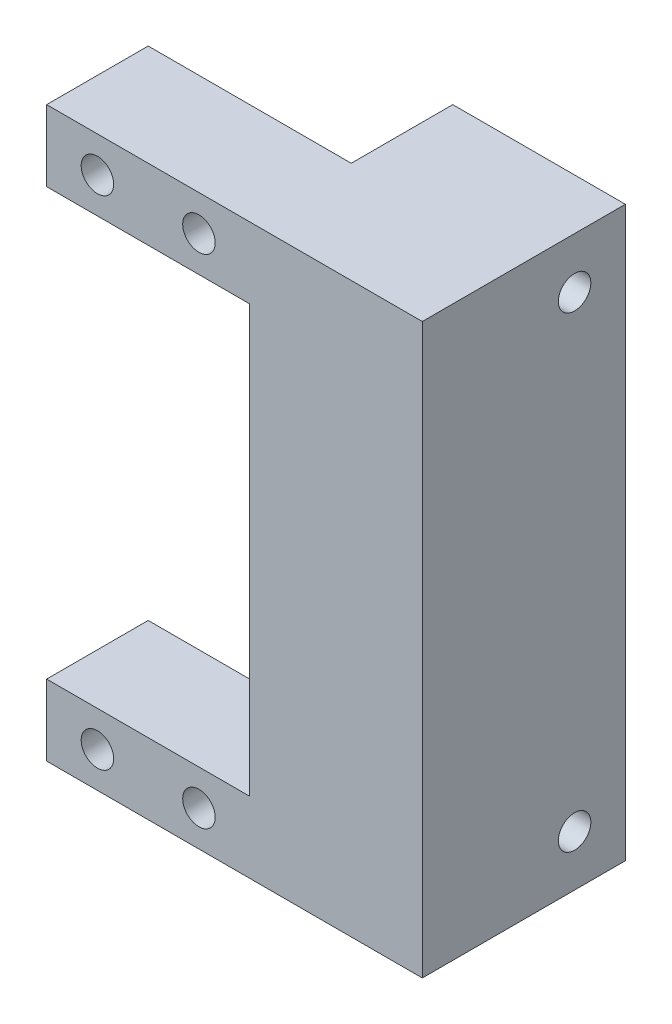
ISO-10303-21;
HEADER;
FILE_DESCRIPTION(('STEP AP214'),'2;1');
FILE_NAME('part.step','',(''),(''),'','','');
FILE_SCHEMA(('AUTOMOTIVE_DESIGN { 1 0 10303 214 1 1 1 1 }'));
ENDSEC;
DATA;
#1=APPLICATION_CONTEXT('core data for automotive mechanical design processes');
#2=APPLICATION_PROTOCOL_DEFINITION('international standard','automotive_design',2000,#1);
#3=PRODUCT_CONTEXT('',#1,'mechanical');
#4=PRODUCT('Part','Part','',(#3));
#5=PRODUCT_RELATED_PRODUCT_CATEGORY('part','',(#4));
#6=PRODUCT_DEFINITION_FORMATION('','',#4);
#7=PRODUCT_DEFINITION_CONTEXT('part definition',#1,'design');
#8=PRODUCT_DEFINITION('design','',#6,#7);
#9=PRODUCT_DEFINITION_SHAPE('','',#8);
#10=(LENGTH_UNIT() NAMED_UNIT(*) SI_UNIT(.MILLI.,.METRE.));
#11=(NAMED_UNIT(*) PLANE_ANGLE_UNIT() SI_UNIT($,.RADIAN.));
#12=(NAMED_UNIT(*) SI_UNIT($,.STERADIAN.) SOLID_ANGLE_UNIT());
#13=UNCERTAINTY_MEASURE_WITH_UNIT(LENGTH_MEASURE(1.E-05),#10,'distance_accuracy_value','');
#14=(GEOMETRIC_REPRESENTATION_CONTEXT(3) GLOBAL_UNCERTAINTY_ASSIGNED_CONTEXT((#13)) GLOBAL_UNIT_ASSIGNED_CONTEXT((#10,
#11,#12)) REPRESENTATION_CONTEXT('',''));
#15=CARTESIAN_POINT('',(0.,0.,0.));
#16=DIRECTION('',(0.,0.,1.));
#17=DIRECTION('',(1.,0.,0.));
#18=AXIS2_PLACEMENT_3D('',#15,#16,#17);
#19=CARTESIAN_POINT('',(0.,0.,0.));
#20=DIRECTION('',(0.,0.,1.));
#21=DIRECTION('',(1.,0.,0.));
#22=AXIS2_PLACEMENT_3D('',#19,#20,#21);
#23=PLANE('',#22);
#24=CARTESIAN_POINT('',(-55.9285714285714,-28.6428571428571,0.));
#25=DIRECTION('',(0.,0.,-1.));
#26=DIRECTION('',(-1.,0.,0.));
#27=AXIS2_PLACEMENT_3D('',#24,#25,#26);
#28=CIRCLE('',#27,1.6);
#29=CARTESIAN_POINT('',(-57.5285714285714,-28.6428571428571,0.));
#30=VERTEX_POINT('',#29);
#31=EDGE_CURVE('E199',#30,#30,#28,.T.);
#32=ORIENTED_EDGE('',*,*,#31,.F.);
#33=EDGE_LOOP('',(#32));
#34=FACE_BOUND('',#33,.T.);
#35=CARTESIAN_POINT('',(-45.9285714285714,-28.6428571428571,0.));
#36=DIRECTION('',(0.,0.,-1.));
#37=DIRECTION('',(-1.,0.,0.));
#38=AXIS2_PLACEMENT_3D('',#35,#36,#37);
#39=CIRCLE('',#38,1.6);
#40=CARTESIAN_POINT('',(-47.5285714285714,-28.6428571428571,0.));
#41=VERTEX_POINT('',#40);
#42=EDGE_CURVE('E203',#41,#41,#39,.T.);
#43=ORIENTED_EDGE('',*,*,#42,.F.);
#44=EDGE_LOOP('',(#43));
#45=FACE_BOUND('',#44,.T.);
#46=DIRECTION('',(0.,1.,0.));
#47=VECTOR('',#46,1.);
#48=CARTESIAN_POINT('',(-40.9285714285714,23.8571428571429,0.));
#49=LINE('',#48,#47);
#50=CARTESIAN_POINT('',(-40.9285714285714,-32.1428571428571,0.));
#51=VERTEX_POINT('',#50);
#52=CARTESIAN_POINT('',(-40.9285714285714,-25.1428571428571,0.));
#53=VERTEX_POINT('',#52);
#54=EDGE_CURVE('E44',#51,#53,#49,.T.);
#55=ORIENTED_EDGE('',*,*,#54,.F.);
#56=DIRECTION('',(1.,0.,0.));
#57=VECTOR('',#56,1.);
#58=CARTESIAN_POINT('',(-60.9285714285714,-32.1428571428571,0.));
#59=LINE('',#58,#57);
#60=CARTESIAN_POINT('',(-60.9285714285714,-32.1428571428571,0.));
#61=VERTEX_POINT('',#60);
#62=EDGE_CURVE('E144',#61,#51,#59,.T.);
#63=ORIENTED_EDGE('',*,*,#62,.F.);
#64=DIRECTION('',(0.,-1.,0.));
#65=VECTOR('',#64,1.);
#66=CARTESIAN_POINT('',(-60.9285714285714,-25.1428571428571,0.));
#67=LINE('',#66,#65);
#68=CARTESIAN_POINT('',(-60.9285714285714,-25.1428571428571,0.));
#69=VERTEX_POINT('',#68);
#70=EDGE_CURVE('E86',#69,#61,#67,.T.);
#71=ORIENTED_EDGE('',*,*,#70,.F.);
#72=DIRECTION('',(-1.,0.,0.));
#73=VECTOR('',#72,1.);
#74=CARTESIAN_POINT('',(-40.9285714285714,-25.1428571428571,0.));
#75=LINE('',#74,#73);
#76=EDGE_CURVE('E141',#53,#69,#75,.T.);
#77=ORIENTED_EDGE('',*,*,#76,.F.);
#78=EDGE_LOOP('',(#55,#63,#71,#77));
#79=FACE_BOUND('',#78,.T.);
#80=ADVANCED_FACE('F34',(#34,#45,#79),#23,.F.);
#81=CARTESIAN_POINT('',(-45.9285714285714,20.3571428571429,0.));
#82=DIRECTION('',(0.,0.,-1.));
#83=DIRECTION('',(-1.,0.,0.));
#84=AXIS2_PLACEMENT_3D('',#81,#82,#83);
#85=CIRCLE('',#84,1.6);
#86=CARTESIAN_POINT('',(-47.5285714285714,20.3571428571429,0.));
#87=VERTEX_POINT('',#86);
#88=EDGE_CURVE('E209',#87,#87,#85,.T.);
#89=ORIENTED_EDGE('',*,*,#88,.F.);
#90=EDGE_LOOP('',(#89));
#91=FACE_BOUND('',#90,.T.);
#92=CARTESIAN_POINT('',(-55.9285714285714,20.3571428571429,0.));
#93=DIRECTION('',(0.,0.,-1.));
#94=DIRECTION('',(-1.,0.,0.));
#95=AXIS2_PLACEMENT_3D('',#92,#93,#94);
#96=CIRCLE('',#95,1.6);
#97=CARTESIAN_POINT('',(-57.5285714285714,20.3571428571429,0.));
#98=VERTEX_POINT('',#97);
#99=EDGE_CURVE('E210',#98,#98,#96,.T.);
#100=ORIENTED_EDGE('',*,*,#99,.F.);
#101=EDGE_LOOP('',(#100));
#102=FACE_BOUND('',#101,.T.);
#103=CARTESIAN_POINT('',(-40.9285714285714,16.8571428571429,0.));
#104=VERTEX_POINT('',#103);
#105=CARTESIAN_POINT('',(-40.9285714285714,23.8571428571429,0.));
#106=VERTEX_POINT('',#105);
#107=EDGE_CURVE('E11',#104,#106,#49,.T.);
#108=ORIENTED_EDGE('',*,*,#107,.F.);
#109=DIRECTION('',(1.,0.,0.));
#110=VECTOR('',#109,1.);
#111=CARTESIAN_POINT('',(-60.9285714285714,16.8571428571429,0.));
#112=LINE('',#111,#110);
#113=CARTESIAN_POINT('',(-60.9285714285714,16.8571428571429,0.));
#114=VERTEX_POINT('',#113);
#115=EDGE_CURVE('E138',#114,#104,#112,.T.);
#116=ORIENTED_EDGE('',*,*,#115,.F.);
#117=DIRECTION('',(0.,-1.,0.));
#118=VECTOR('',#117,1.);
#119=CARTESIAN_POINT('',(-60.9285714285714,23.8571428571429,0.));
#120=LINE('',#119,#118);
#121=CARTESIAN_POINT('',(-60.9285714285714,23.8571428571429,0.));
#122=VERTEX_POINT('',#121);
#123=EDGE_CURVE('E135',#122,#114,#120,.T.);
#124=ORIENTED_EDGE('',*,*,#123,.F.);
#125=DIRECTION('',(-1.,0.,0.));
#126=VECTOR('',#125,1.);
#127=CARTESIAN_POINT('',(-33.9285714285714,23.8571428571429,0.));
#128=LINE('',#127,#126);
#129=EDGE_CURVE('E133',#106,#122,#128,.T.);
#130=ORIENTED_EDGE('',*,*,#129,.F.);
#131=EDGE_LOOP('',(#108,#116,#124,#130));
#132=FACE_BOUND('',#131,.T.);
#133=ADVANCED_FACE('F167',(#91,#102,#132),#23,.F.);
#134=CARTESIAN_POINT('',(-33.9285714285714,23.8571428571429,10.));
#135=DIRECTION('',(0.,-1.,0.));
#136=DIRECTION('',(1.,0.,0.));
#137=AXIS2_PLACEMENT_3D('',#134,#135,#136);
#138=PLANE('',#137);
#139=DIRECTION('',(-1.,0.,0.));
#140=VECTOR('',#139,1.);
#141=CARTESIAN_POINT('',(-33.9285714285714,23.8571428571429,10.));
#142=LINE('',#141,#140);
#143=CARTESIAN_POINT('',(-23.9285714285714,23.8571428571429,10.));
#144=VERTEX_POINT('',#143);
#145=CARTESIAN_POINT('',(-60.9285714285714,23.8571428571429,10.));
#146=VERTEX_POINT('',#145);
#147=EDGE_CURVE('E146',#144,#146,#142,.T.);
#148=ORIENTED_EDGE('',*,*,#147,.F.);
#149=DIRECTION('',(0.,0.,1.));
#150=VECTOR('',#149,1.);
#151=CARTESIAN_POINT('',(-23.9285714285714,23.8571428571429,-10.));
#152=LINE('',#151,#150);
#153=CARTESIAN_POINT('',(-23.9285714285714,23.8571428571429,-10.));
#154=VERTEX_POINT('',#153);
#155=EDGE_CURVE('E232',#154,#144,#152,.T.);
#156=ORIENTED_EDGE('',*,*,#155,.F.);
#157=DIRECTION('',(1.,0.,0.));
#158=VECTOR('',#157,1.);
#159=CARTESIAN_POINT('',(-33.9285714285714,23.8571428571429,-10.));
#160=LINE('',#159,#158);
#161=CARTESIAN_POINT('',(-40.9285714285714,23.8571428571429,-10.));
#162=VERTEX_POINT('',#161);
#163=EDGE_CURVE('E180',#162,#154,#160,.T.);
#164=ORIENTED_EDGE('',*,*,#163,.F.);
#165=DIRECTION('',(0.,0.,1.));
#166=VECTOR('',#165,1.);
#167=CARTESIAN_POINT('',(-40.9285714285714,23.8571428571429,-10.));
#168=LINE('',#167,#166);
#169=EDGE_CURVE('E165',#162,#106,#168,.T.);
#170=ORIENTED_EDGE('',*,*,#169,.T.);
#171=ORIENTED_EDGE('',*,*,#129,.T.);
#172=DIRECTION('',(0.,0.,-1.));
#173=VECTOR('',#172,1.);
#174=CARTESIAN_POINT('',(-60.9285714285714,23.8571428571429,10.));
#175=LINE('',#174,#173);
#176=EDGE_CURVE('E38',#146,#122,#175,.T.);
#177=ORIENTED_EDGE('',*,*,#176,.F.);
#178=EDGE_LOOP('',(#148,#156,#164,#170,#171,#177));
#179=FACE_BOUND('',#178,.T.);
#180=ADVANCED_FACE('F36',(#179),#138,.F.);
#181=CARTESIAN_POINT('',(-60.9285714285714,23.8571428571429,10.));
#182=DIRECTION('',(1.,0.,0.));
#183=DIRECTION('',(0.,0.,-1.));
#184=AXIS2_PLACEMENT_3D('',#181,#182,#183);
#185=PLANE('',#184);
#186=ORIENTED_EDGE('',*,*,#123,.T.);
#187=DIRECTION('',(0.,0.,-1.));
#188=VECTOR('',#187,1.);
#189=CARTESIAN_POINT('',(-60.9285714285714,16.8571428571429,10.));
#190=LINE('',#189,#188);
#191=CARTESIAN_POINT('',(-60.9285714285714,16.8571428571429,10.));
#192=VERTEX_POINT('',#191);
#193=EDGE_CURVE('E149',#192,#114,#190,.T.);
#194=ORIENTED_EDGE('',*,*,#193,.F.);
#195=DIRECTION('',(0.,-1.,0.));
#196=VECTOR('',#195,1.);
#197=CARTESIAN_POINT('',(-60.9285714285714,23.8571428571429,10.));
#198=LINE('',#197,#196);
#199=EDGE_CURVE('E95',#146,#192,#198,.T.);
#200=ORIENTED_EDGE('',*,*,#199,.F.);
#201=ORIENTED_EDGE('',*,*,#176,.T.);
#202=EDGE_LOOP('',(#186,#194,#200,#201));
#203=FACE_BOUND('',#202,.T.);
#204=ADVANCED_FACE('F154',(#203),#185,.F.);
#205=CARTESIAN_POINT('',(-60.9285714285714,16.8571428571429,10.));
#206=DIRECTION('',(0.,1.,0.));
#207=DIRECTION('',(0.,0.,1.));
#208=AXIS2_PLACEMENT_3D('',#205,#206,#207);
#209=PLANE('',#208);
#210=ORIENTED_EDGE('',*,*,#115,.T.);
#211=DIRECTION('',(0.,0.,-1.));
#212=VECTOR('',#211,1.);
#213=CARTESIAN_POINT('',(-40.9285714285714,16.8571428571429,10.));
#214=LINE('',#213,#212);
#215=CARTESIAN_POINT('',(-40.9285714285714,16.8571428571429,10.));
#216=VERTEX_POINT('',#215);
#217=EDGE_CURVE('E122',#216,#104,#214,.T.);
#218=ORIENTED_EDGE('',*,*,#217,.F.);
#219=DIRECTION('',(1.,0.,0.));
#220=VECTOR('',#219,1.);
#221=CARTESIAN_POINT('',(-60.9285714285714,16.8571428571429,10.));
#222=LINE('',#221,#220);
#223=EDGE_CURVE('E113',#192,#216,#222,.T.);
#224=ORIENTED_EDGE('',*,*,#223,.F.);
#225=ORIENTED_EDGE('',*,*,#193,.T.);
#226=EDGE_LOOP('',(#210,#218,#224,#225));
#227=FACE_BOUND('',#226,.T.);
#228=ADVANCED_FACE('F168',(#227),#209,.F.);
#229=CARTESIAN_POINT('',(-40.9285714285714,16.8571428571429,10.));
#230=DIRECTION('',(1.,0.,0.));
#231=DIRECTION('',(0.,1.,0.));
#232=AXIS2_PLACEMENT_3D('',#229,#230,#231);
#233=PLANE('',#232);
#234=CARTESIAN_POINT('',(-40.9285714285714,18.8571428571429,-5.));
#235=DIRECTION('',(1.,0.,0.));
#236=DIRECTION('',(0.,1.,0.));
#237=AXIS2_PLACEMENT_3D('',#234,#235,#236);
#238=CIRCLE('',#237,1.6);
#239=CARTESIAN_POINT('',(-40.9285714285714,20.4571428571429,-5.));
#240=VERTEX_POINT('',#239);
#241=EDGE_CURVE('E195',#240,#240,#238,.T.);
#242=ORIENTED_EDGE('',*,*,#241,.T.);
#243=EDGE_LOOP('',(#242));
#244=FACE_BOUND('',#243,.T.);
#245=CARTESIAN_POINT('',(-40.9285714285714,-27.1428571428572,-4.99999999999999));
#246=DIRECTION('',(1.,0.,0.));
#247=DIRECTION('',(0.,1.,0.));
#248=AXIS2_PLACEMENT_3D('',#245,#246,#247);
#249=CIRCLE('',#248,1.6);
#250=CARTESIAN_POINT('',(-40.9285714285714,-25.5428571428572,-4.99999999999999));
#251=VERTEX_POINT('',#250);
#252=EDGE_CURVE('E245',#251,#251,#249,.T.);
#253=ORIENTED_EDGE('',*,*,#252,.T.);
#254=EDGE_LOOP('',(#253));
#255=FACE_BOUND('',#254,.T.);
#256=ORIENTED_EDGE('',*,*,#217,.T.);
#257=ORIENTED_EDGE('',*,*,#107,.T.);
#258=ORIENTED_EDGE('',*,*,#169,.F.);
#259=DIRECTION('',(0.,1.,0.));
#260=VECTOR('',#259,1.);
#261=CARTESIAN_POINT('',(-40.9285714285714,23.8571428571429,-10.));
#262=LINE('',#261,#260);
#263=CARTESIAN_POINT('',(-40.9285714285714,-32.1428571428571,-10.));
#264=VERTEX_POINT('',#263);
#265=EDGE_CURVE('E186',#264,#162,#262,.T.);
#266=ORIENTED_EDGE('',*,*,#265,.F.);
#267=DIRECTION('',(0.,0.,1.));
#268=VECTOR('',#267,1.);
#269=CARTESIAN_POINT('',(-40.9285714285714,-32.1428571428571,-10.));
#270=LINE('',#269,#268);
#271=EDGE_CURVE('E197',#264,#51,#270,.T.);
#272=ORIENTED_EDGE('',*,*,#271,.T.);
#273=ORIENTED_EDGE('',*,*,#54,.T.);
#274=DIRECTION('',(0.,0.,-1.));
#275=VECTOR('',#274,1.);
#276=CARTESIAN_POINT('',(-40.9285714285714,-25.1428571428571,10.));
#277=LINE('',#276,#275);
#278=CARTESIAN_POINT('',(-40.9285714285714,-25.1428571428571,10.));
#279=VERTEX_POINT('',#278);
#280=EDGE_CURVE('E118',#279,#53,#277,.T.);
#281=ORIENTED_EDGE('',*,*,#280,.F.);
#282=DIRECTION('',(0.,-1.,0.));
#283=VECTOR('',#282,1.);
#284=CARTESIAN_POINT('',(-40.9285714285714,16.8571428571429,10.));
#285=LINE('',#284,#283);
#286=EDGE_CURVE('E106',#216,#279,#285,.T.);
#287=ORIENTED_EDGE('',*,*,#286,.F.);
#288=EDGE_LOOP('',(#256,#257,#258,#266,#272,#273,#281,#287));
#289=FACE_BOUND('',#288,.T.);
#290=ADVANCED_FACE('F119',(#244,#255,#289),#233,.F.);
#291=CARTESIAN_POINT('',(-40.9285714285714,-25.1428571428571,10.));
#292=DIRECTION('',(0.,-1.,0.));
#293=DIRECTION('',(1.,0.,0.));
#294=AXIS2_PLACEMENT_3D('',#291,#292,#293);
#295=PLANE('',#294);
#296=ORIENTED_EDGE('',*,*,#76,.T.);
#297=DIRECTION('',(0.,0.,-1.));
#298=VECTOR('',#297,1.);
#299=CARTESIAN_POINT('',(-60.9285714285714,-25.1428571428571,10.));
#300=LINE('',#299,#298);
#301=CARTESIAN_POINT('',(-60.9285714285714,-25.1428571428571,10.));
#302=VERTEX_POINT('',#301);
#303=EDGE_CURVE('E123',#302,#69,#300,.T.);
#304=ORIENTED_EDGE('',*,*,#303,.F.);
#305=DIRECTION('',(-1.,0.,0.));
#306=VECTOR('',#305,1.);
#307=CARTESIAN_POINT('',(-40.9285714285714,-25.1428571428571,10.));
#308=LINE('',#307,#306);
#309=EDGE_CURVE('E110',#279,#302,#308,.T.);
#310=ORIENTED_EDGE('',*,*,#309,.F.);
#311=ORIENTED_EDGE('',*,*,#280,.T.);
#312=EDGE_LOOP('',(#296,#304,#310,#311));
#313=FACE_BOUND('',#312,.T.);
#314=ADVANCED_FACE('F125',(#313),#295,.F.);
#315=CARTESIAN_POINT('',(-60.9285714285714,-25.1428571428571,10.));
#316=DIRECTION('',(1.,0.,0.));
#317=DIRECTION('',(0.,0.,-1.));
#318=AXIS2_PLACEMENT_3D('',#315,#316,#317);
#319=PLANE('',#318);
#320=ORIENTED_EDGE('',*,*,#70,.T.);
#321=DIRECTION('',(0.,0.,-1.));
#322=VECTOR('',#321,1.);
#323=CARTESIAN_POINT('',(-60.9285714285714,-32.1428571428571,10.));
#324=LINE('',#323,#322);
#325=CARTESIAN_POINT('',(-60.9285714285714,-32.1428571428571,10.));
#326=VERTEX_POINT('',#325);
#327=EDGE_CURVE('E132',#326,#61,#324,.T.);
#328=ORIENTED_EDGE('',*,*,#327,.F.);
#329=DIRECTION('',(0.,-1.,0.));
#330=VECTOR('',#329,1.);
#331=CARTESIAN_POINT('',(-60.9285714285714,-25.1428571428571,10.));
#332=LINE('',#331,#330);
#333=EDGE_CURVE('E59',#302,#326,#332,.T.);
#334=ORIENTED_EDGE('',*,*,#333,.F.);
#335=ORIENTED_EDGE('',*,*,#303,.T.);
#336=EDGE_LOOP('',(#320,#328,#334,#335));
#337=FACE_BOUND('',#336,.T.);
#338=ADVANCED_FACE('F289',(#337),#319,.F.);
#339=CARTESIAN_POINT('',(-60.9285714285714,-32.1428571428571,10.));
#340=DIRECTION('',(0.,1.,0.));
#341=DIRECTION('',(0.,0.,1.));
#342=AXIS2_PLACEMENT_3D('',#339,#340,#341);
#343=PLANE('',#342);
#344=ORIENTED_EDGE('',*,*,#62,.T.);
#345=ORIENTED_EDGE('',*,*,#271,.F.);
#346=DIRECTION('',(-1.,0.,0.));
#347=VECTOR('',#346,1.);
#348=CARTESIAN_POINT('',(-33.9285714285714,-32.1428571428571,-10.));
#349=LINE('',#348,#347);
#350=CARTESIAN_POINT('',(-23.9285714285714,-32.1428571428571,-10.));
#351=VERTEX_POINT('',#350);
#352=EDGE_CURVE('E188',#351,#264,#349,.T.);
#353=ORIENTED_EDGE('',*,*,#352,.F.);
#354=DIRECTION('',(0.,0.,-1.));
#355=VECTOR('',#354,1.);
#356=CARTESIAN_POINT('',(-23.9285714285714,-32.1428571428571,10.));
#357=LINE('',#356,#355);
#358=CARTESIAN_POINT('',(-23.9285714285714,-32.1428571428571,10.));
#359=VERTEX_POINT('',#358);
#360=EDGE_CURVE('E231',#359,#351,#357,.T.);
#361=ORIENTED_EDGE('',*,*,#360,.F.);
#362=DIRECTION('',(1.,0.,0.));
#363=VECTOR('',#362,1.);
#364=CARTESIAN_POINT('',(-60.9285714285714,-32.1428571428571,10.));
#365=LINE('',#364,#363);
#366=EDGE_CURVE('E127',#326,#359,#365,.T.);
#367=ORIENTED_EDGE('',*,*,#366,.F.);
#368=ORIENTED_EDGE('',*,*,#327,.T.);
#369=EDGE_LOOP('',(#344,#345,#353,#361,#367,#368));
#370=FACE_BOUND('',#369,.T.);
#371=ADVANCED_FACE('F286',(#370),#343,.F.);
#372=CARTESIAN_POINT('',(0.,0.,10.));
#373=DIRECTION('',(0.,0.,1.));
#374=DIRECTION('',(1.,0.,0.));
#375=AXIS2_PLACEMENT_3D('',#372,#373,#374);
#376=PLANE('',#375);
#377=CARTESIAN_POINT('',(-55.9285714285714,20.3571428571429,10.));
#378=DIRECTION('',(0.,0.,-1.));
#379=DIRECTION('',(-1.,0.,0.));
#380=AXIS2_PLACEMENT_3D('',#377,#378,#379);
#381=CIRCLE('',#380,1.6);
#382=CARTESIAN_POINT('',(-57.5285714285714,20.3571428571429,10.));
#383=VERTEX_POINT('',#382);
#384=EDGE_CURVE('E206',#383,#383,#381,.T.);
#385=ORIENTED_EDGE('',*,*,#384,.T.);
#386=EDGE_LOOP('',(#385));
#387=FACE_BOUND('',#386,.T.);
#388=CARTESIAN_POINT('',(-45.9285714285714,-28.6428571428571,10.));
#389=DIRECTION('',(0.,0.,-1.));
#390=DIRECTION('',(-1.,0.,0.));
#391=AXIS2_PLACEMENT_3D('',#388,#389,#390);
#392=CIRCLE('',#391,1.6);
#393=CARTESIAN_POINT('',(-47.5285714285714,-28.6428571428571,10.));
#394=VERTEX_POINT('',#393);
#395=EDGE_CURVE('E213',#394,#394,#392,.T.);
#396=ORIENTED_EDGE('',*,*,#395,.T.);
#397=EDGE_LOOP('',(#396));
#398=FACE_BOUND('',#397,.T.);
#399=CARTESIAN_POINT('',(-55.9285714285714,-28.6428571428571,10.));
#400=DIRECTION('',(0.,0.,-1.));
#401=DIRECTION('',(-1.,0.,0.));
#402=AXIS2_PLACEMENT_3D('',#399,#400,#401);
#403=CIRCLE('',#402,1.6);
#404=CARTESIAN_POINT('',(-57.5285714285714,-28.6428571428571,10.));
#405=VERTEX_POINT('',#404);
#406=EDGE_CURVE('E200',#405,#405,#403,.T.);
#407=ORIENTED_EDGE('',*,*,#406,.T.);
#408=EDGE_LOOP('',(#407));
#409=FACE_BOUND('',#408,.T.);
#410=CARTESIAN_POINT('',(-45.9285714285714,20.3571428571429,10.));
#411=DIRECTION('',(0.,0.,-1.));
#412=DIRECTION('',(-1.,0.,0.));
#413=AXIS2_PLACEMENT_3D('',#410,#411,#412);
#414=CIRCLE('',#413,1.6);
#415=CARTESIAN_POINT('',(-47.5285714285714,20.3571428571429,10.));
#416=VERTEX_POINT('',#415);
#417=EDGE_CURVE('E136',#416,#416,#414,.T.);
#418=ORIENTED_EDGE('',*,*,#417,.T.);
#419=EDGE_LOOP('',(#418));
#420=FACE_BOUND('',#419,.T.);
#421=ORIENTED_EDGE('',*,*,#147,.T.);
#422=ORIENTED_EDGE('',*,*,#199,.T.);
#423=ORIENTED_EDGE('',*,*,#223,.T.);
#424=ORIENTED_EDGE('',*,*,#286,.T.);
#425=ORIENTED_EDGE('',*,*,#309,.T.);
#426=ORIENTED_EDGE('',*,*,#333,.T.);
#427=ORIENTED_EDGE('',*,*,#366,.T.);
#428=DIRECTION('',(0.,-1.,0.));
#429=VECTOR('',#428,1.);
#430=CARTESIAN_POINT('',(-23.9285714285714,23.8571428571429,10.));
#431=LINE('',#430,#429);
#432=EDGE_CURVE('E224',#144,#359,#431,.T.);
#433=ORIENTED_EDGE('',*,*,#432,.F.);
#434=EDGE_LOOP('',(#421,#422,#423,#424,#425,#426,#427,#433));
#435=FACE_BOUND('',#434,.T.);
#436=ADVANCED_FACE('F108',(#387,#398,#409,#420,#435),#376,.T.);
#437=CARTESIAN_POINT('',(-45.9285714285714,20.3571428571429,10.));
#438=DIRECTION('',(0.,0.,-1.));
#439=DIRECTION('',(-1.,0.,0.));
#440=AXIS2_PLACEMENT_3D('',#437,#438,#439);
#441=CYLINDRICAL_SURFACE('',#440,1.6);
#442=ORIENTED_EDGE('',*,*,#417,.F.);
#443=EDGE_LOOP('',(#442));
#444=FACE_BOUND('',#443,.T.);
#445=ORIENTED_EDGE('',*,*,#88,.T.);
#446=EDGE_LOOP('',(#445));
#447=FACE_BOUND('',#446,.T.);
#448=ADVANCED_FACE('F392',(#444,#447),#441,.F.);
#449=CARTESIAN_POINT('',(-55.9285714285714,-28.6428571428571,10.));
#450=DIRECTION('',(0.,0.,-1.));
#451=DIRECTION('',(-1.,0.,0.));
#452=AXIS2_PLACEMENT_3D('',#449,#450,#451);
#453=CYLINDRICAL_SURFACE('',#452,1.6);
#454=ORIENTED_EDGE('',*,*,#406,.F.);
#455=EDGE_LOOP('',(#454));
#456=FACE_BOUND('',#455,.T.);
#457=ORIENTED_EDGE('',*,*,#31,.T.);
#458=EDGE_LOOP('',(#457));
#459=FACE_BOUND('',#458,.T.);
#460=ADVANCED_FACE('F410',(#456,#459),#453,.F.);
#461=CARTESIAN_POINT('',(-45.9285714285714,-28.6428571428571,10.));
#462=DIRECTION('',(0.,0.,-1.));
#463=DIRECTION('',(-1.,0.,0.));
#464=AXIS2_PLACEMENT_3D('',#461,#462,#463);
#465=CYLINDRICAL_SURFACE('',#464,1.6);
#466=ORIENTED_EDGE('',*,*,#395,.F.);
#467=EDGE_LOOP('',(#466));
#468=FACE_BOUND('',#467,.T.);
#469=ORIENTED_EDGE('',*,*,#42,.T.);
#470=EDGE_LOOP('',(#469));
#471=FACE_BOUND('',#470,.T.);
#472=ADVANCED_FACE('F419',(#468,#471),#465,.F.);
#473=CARTESIAN_POINT('',(-55.9285714285714,20.3571428571429,10.));
#474=DIRECTION('',(0.,0.,-1.));
#475=DIRECTION('',(-1.,0.,0.));
#476=AXIS2_PLACEMENT_3D('',#473,#474,#475);
#477=CYLINDRICAL_SURFACE('',#476,1.6);
#478=ORIENTED_EDGE('',*,*,#384,.F.);
#479=EDGE_LOOP('',(#478));
#480=FACE_BOUND('',#479,.T.);
#481=ORIENTED_EDGE('',*,*,#99,.T.);
#482=EDGE_LOOP('',(#481));
#483=FACE_BOUND('',#482,.T.);
#484=ADVANCED_FACE('F271',(#480,#483),#477,.F.);
#485=CARTESIAN_POINT('',(0.,0.,-10.));
#486=DIRECTION('',(0.,0.,-1.));
#487=DIRECTION('',(-1.,0.,0.));
#488=AXIS2_PLACEMENT_3D('',#485,#486,#487);
#489=PLANE('',#488);
#490=ORIENTED_EDGE('',*,*,#163,.T.);
#491=DIRECTION('',(0.,1.,0.));
#492=VECTOR('',#491,1.);
#493=CARTESIAN_POINT('',(-23.9285714285714,-32.1428571428571,-10.));
#494=LINE('',#493,#492);
#495=EDGE_CURVE('E235',#351,#154,#494,.T.);
#496=ORIENTED_EDGE('',*,*,#495,.F.);
#497=ORIENTED_EDGE('',*,*,#352,.T.);
#498=ORIENTED_EDGE('',*,*,#265,.T.);
#499=EDGE_LOOP('',(#490,#496,#497,#498));
#500=FACE_BOUND('',#499,.T.);
#501=ADVANCED_FACE('F187',(#500),#489,.T.);
#502=CARTESIAN_POINT('',(-33.9285714285714,-27.1428571428572,-4.99999999999999));
#503=DIRECTION('',(-1.,0.,0.));
#504=DIRECTION('',(0.,-1.,0.));
#505=AXIS2_PLACEMENT_3D('',#502,#503,#504);
#506=CYLINDRICAL_SURFACE('',#505,1.6);
#507=ORIENTED_EDGE('',*,*,#252,.F.);
#508=EDGE_LOOP('',(#507));
#509=FACE_BOUND('',#508,.T.);
#510=CARTESIAN_POINT('',(-23.9285714285714,-27.1428571428571,-4.99999999999999));
#511=DIRECTION('',(-1.,0.,0.));
#512=DIRECTION('',(0.,-1.,0.));
#513=AXIS2_PLACEMENT_3D('',#510,#511,#512);
#514=CIRCLE('',#513,1.6);
#515=CARTESIAN_POINT('',(-23.9285714285714,-28.7428571428572,-4.99999999999999));
#516=VERTEX_POINT('',#515);
#517=EDGE_CURVE('E239',#516,#516,#514,.T.);
#518=ORIENTED_EDGE('',*,*,#517,.F.);
#519=EDGE_LOOP('',(#518));
#520=FACE_BOUND('',#519,.T.);
#521=ADVANCED_FACE('F255',(#509,#520),#506,.F.);
#522=CARTESIAN_POINT('',(-33.9285714285714,18.8571428571429,-5.));
#523=DIRECTION('',(-1.,0.,0.));
#524=DIRECTION('',(0.,-1.,0.));
#525=AXIS2_PLACEMENT_3D('',#522,#523,#524);
#526=CYLINDRICAL_SURFACE('',#525,1.6);
#527=ORIENTED_EDGE('',*,*,#241,.F.);
#528=EDGE_LOOP('',(#527));
#529=FACE_BOUND('',#528,.T.);
#530=CARTESIAN_POINT('',(-23.9285714285714,18.8571428571429,-5.));
#531=DIRECTION('',(-1.,0.,0.));
#532=DIRECTION('',(0.,-1.,0.));
#533=AXIS2_PLACEMENT_3D('',#530,#531,#532);
#534=CIRCLE('',#533,1.6);
#535=CARTESIAN_POINT('',(-23.9285714285714,17.2571428571429,-5.));
#536=VERTEX_POINT('',#535);
#537=EDGE_CURVE('E236',#536,#536,#534,.T.);
#538=ORIENTED_EDGE('',*,*,#537,.F.);
#539=EDGE_LOOP('',(#538));
#540=FACE_BOUND('',#539,.T.);
#541=ADVANCED_FACE('F252',(#529,#540),#526,.F.);
#542=CARTESIAN_POINT('',(-23.9285714285714,0.,0.));
#543=DIRECTION('',(1.,0.,0.));
#544=DIRECTION('',(0.,0.,-1.));
#545=AXIS2_PLACEMENT_3D('',#542,#543,#544);
#546=PLANE('',#545);
#547=ORIENTED_EDGE('',*,*,#537,.T.);
#548=EDGE_LOOP('',(#547));
#549=FACE_BOUND('',#548,.T.);
#550=ORIENTED_EDGE('',*,*,#517,.T.);
#551=EDGE_LOOP('',(#550));
#552=FACE_BOUND('',#551,.T.);
#553=ORIENTED_EDGE('',*,*,#155,.T.);
#554=ORIENTED_EDGE('',*,*,#432,.T.);
#555=ORIENTED_EDGE('',*,*,#360,.T.);
#556=ORIENTED_EDGE('',*,*,#495,.T.);
#557=EDGE_LOOP('',(#553,#554,#555,#556));
#558=FACE_BOUND('',#557,.T.);
#559=ADVANCED_FACE('F234',(#549,#552,#558),#546,.T.);
#560=CLOSED_SHELL('',(#80,#133,#180,#204,#228,#290,#314,#338,#371,#436,#448,#460,#472,#484,#501,
#521,#541,#559));
#561=MANIFOLD_SOLID_BREP('B2',#560);
#562=ADVANCED_BREP_SHAPE_REPRESENTATION('',(#18,#561),#14);
#563=SHAPE_DEFINITION_REPRESENTATION(#9,#562);
ENDSEC;
END-ISO-10303-21;
